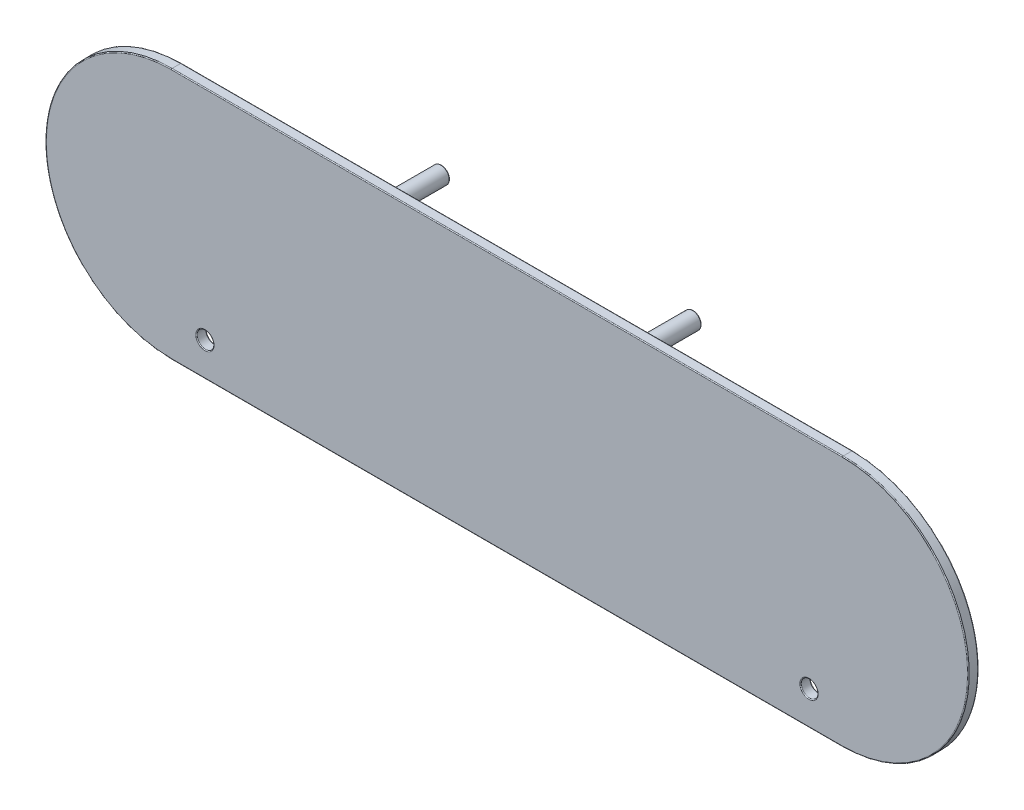
ISO-10303-21;
HEADER;
FILE_DESCRIPTION(('STEP AP214'),'2;1');
FILE_NAME('part.step','',(''),(''),'','','');
FILE_SCHEMA(('AUTOMOTIVE_DESIGN { 1 0 10303 214 1 1 1 1 }'));
ENDSEC;
DATA;
#1=APPLICATION_CONTEXT('core data for automotive mechanical design processes');
#2=APPLICATION_PROTOCOL_DEFINITION('international standard','automotive_design',2000,#1);
#3=PRODUCT_CONTEXT('',#1,'mechanical');
#4=PRODUCT('Part','Part','',(#3));
#5=PRODUCT_RELATED_PRODUCT_CATEGORY('part','',(#4));
#6=PRODUCT_DEFINITION_FORMATION('','',#4);
#7=PRODUCT_DEFINITION_CONTEXT('part definition',#1,'design');
#8=PRODUCT_DEFINITION('design','',#6,#7);
#9=PRODUCT_DEFINITION_SHAPE('','',#8);
#10=(LENGTH_UNIT() NAMED_UNIT(*) SI_UNIT(.MILLI.,.METRE.));
#11=(NAMED_UNIT(*) PLANE_ANGLE_UNIT() SI_UNIT($,.RADIAN.));
#12=(NAMED_UNIT(*) SI_UNIT($,.STERADIAN.) SOLID_ANGLE_UNIT());
#13=UNCERTAINTY_MEASURE_WITH_UNIT(LENGTH_MEASURE(1.E-05),#10,'distance_accuracy_value','');
#14=(GEOMETRIC_REPRESENTATION_CONTEXT(3) GLOBAL_UNCERTAINTY_ASSIGNED_CONTEXT((#13)) GLOBAL_UNIT_ASSIGNED_CONTEXT((#10,
#11,#12)) REPRESENTATION_CONTEXT('',''));
#15=CARTESIAN_POINT('',(0.,0.,0.));
#16=DIRECTION('',(0.,0.,1.));
#17=DIRECTION('',(1.,0.,0.));
#18=AXIS2_PLACEMENT_3D('',#15,#16,#17);
#19=CARTESIAN_POINT('',(0.,-37.5,3.));
#20=DIRECTION('',(0.,1.,0.));
#21=DIRECTION('',(0.,0.,1.));
#22=AXIS2_PLACEMENT_3D('',#19,#20,#21);
#23=PLANE('',#22);
#24=DIRECTION('',(0.,0.,-1.));
#25=VECTOR('',#24,1.);
#26=CARTESIAN_POINT('',(-100.,-37.5,3.));
#27=LINE('',#26,#25);
#28=CARTESIAN_POINT('',(-100.,-37.5,2.75));
#29=VERTEX_POINT('',#28);
#30=CARTESIAN_POINT('',(-100.,-37.5,0.25));
#31=VERTEX_POINT('',#30);
#32=EDGE_CURVE('E344',#29,#31,#27,.T.);
#33=ORIENTED_EDGE('',*,*,#32,.T.);
#34=DIRECTION('',(1.,0.,0.));
#35=VECTOR('',#34,1.);
#36=CARTESIAN_POINT('',(0.,-37.5,0.25));
#37=LINE('',#36,#35);
#38=CARTESIAN_POINT('',(100.,-37.5,0.25));
#39=VERTEX_POINT('',#38);
#40=EDGE_CURVE('E145',#31,#39,#37,.T.);
#41=ORIENTED_EDGE('',*,*,#40,.T.);
#42=DIRECTION('',(0.,0.,-1.));
#43=VECTOR('',#42,1.);
#44=CARTESIAN_POINT('',(100.,-37.5,3.));
#45=LINE('',#44,#43);
#46=CARTESIAN_POINT('',(100.,-37.5,2.75));
#47=VERTEX_POINT('',#46);
#48=EDGE_CURVE('E129',#47,#39,#45,.T.);
#49=ORIENTED_EDGE('',*,*,#48,.F.);
#50=DIRECTION('',(1.,0.,0.));
#51=VECTOR('',#50,1.);
#52=CARTESIAN_POINT('',(-100.,-37.5,2.75));
#53=LINE('',#52,#51);
#54=EDGE_CURVE('E142',#47,#29,#53,.F.);
#55=ORIENTED_EDGE('',*,*,#54,.T.);
#56=EDGE_LOOP('',(#33,#41,#49,#55));
#57=FACE_BOUND('',#56,.T.);
#58=ADVANCED_FACE('F60',(#57),#23,.F.);
#59=CARTESIAN_POINT('',(100.,0.,3.));
#60=DIRECTION('',(0.,0.,-1.));
#61=DIRECTION('',(-1.,0.,0.));
#62=AXIS2_PLACEMENT_3D('',#59,#60,#61);
#63=CYLINDRICAL_SURFACE('',#62,37.5);
#64=DIRECTION('',(0.,0.,-1.));
#65=VECTOR('',#64,1.);
#66=CARTESIAN_POINT('',(100.,37.5,3.));
#67=LINE('',#66,#65);
#68=CARTESIAN_POINT('',(100.,37.5,2.75));
#69=VERTEX_POINT('',#68);
#70=CARTESIAN_POINT('',(100.,37.5,0.25));
#71=VERTEX_POINT('',#70);
#72=EDGE_CURVE('E131',#69,#71,#67,.T.);
#73=ORIENTED_EDGE('',*,*,#72,.F.);
#74=CARTESIAN_POINT('',(100.,0.,2.75));
#75=DIRECTION('',(0.,0.,1.));
#76=DIRECTION('',(1.,0.,0.));
#77=AXIS2_PLACEMENT_3D('',#74,#75,#76);
#78=CIRCLE('',#77,37.5);
#79=EDGE_CURVE('E126',#69,#47,#78,.F.);
#80=ORIENTED_EDGE('',*,*,#79,.T.);
#81=ORIENTED_EDGE('',*,*,#48,.T.);
#82=CARTESIAN_POINT('',(100.,0.,0.25));
#83=DIRECTION('',(0.,0.,1.));
#84=DIRECTION('',(1.,0.,0.));
#85=AXIS2_PLACEMENT_3D('',#82,#83,#84);
#86=CIRCLE('',#85,37.5);
#87=EDGE_CURVE('E136',#39,#71,#86,.T.);
#88=ORIENTED_EDGE('',*,*,#87,.T.);
#89=EDGE_LOOP('',(#73,#80,#81,#88));
#90=FACE_BOUND('',#89,.T.);
#91=ADVANCED_FACE('F128',(#90),#63,.T.);
#92=CARTESIAN_POINT('',(0.,37.5,3.));
#93=DIRECTION('',(0.,1.,0.));
#94=DIRECTION('',(0.,0.,1.));
#95=AXIS2_PLACEMENT_3D('',#92,#93,#94);
#96=PLANE('',#95);
#97=ORIENTED_EDGE('',*,*,#72,.T.);
#98=DIRECTION('',(1.,0.,0.));
#99=VECTOR('',#98,1.);
#100=CARTESIAN_POINT('',(-100.,37.5,0.25));
#101=LINE('',#100,#99);
#102=CARTESIAN_POINT('',(-100.,37.5,0.25));
#103=VERTEX_POINT('',#102);
#104=EDGE_CURVE('E182',#71,#103,#101,.F.);
#105=ORIENTED_EDGE('',*,*,#104,.T.);
#106=DIRECTION('',(0.,0.,-1.));
#107=VECTOR('',#106,1.);
#108=CARTESIAN_POINT('',(-100.,37.5,3.));
#109=LINE('',#108,#107);
#110=CARTESIAN_POINT('',(-100.,37.5,2.75));
#111=VERTEX_POINT('',#110);
#112=EDGE_CURVE('E334',#111,#103,#109,.T.);
#113=ORIENTED_EDGE('',*,*,#112,.F.);
#114=DIRECTION('',(1.,0.,0.));
#115=VECTOR('',#114,1.);
#116=CARTESIAN_POINT('',(0.,37.5,2.75));
#117=LINE('',#116,#115);
#118=EDGE_CURVE('E180',#111,#69,#117,.T.);
#119=ORIENTED_EDGE('',*,*,#118,.T.);
#120=EDGE_LOOP('',(#97,#105,#113,#119));
#121=FACE_BOUND('',#120,.T.);
#122=ADVANCED_FACE('F330',(#121),#96,.T.);
#123=CARTESIAN_POINT('',(90.,-27.5,3.));
#124=DIRECTION('',(0.,0.,-1.));
#125=DIRECTION('',(-1.,0.,0.));
#126=AXIS2_PLACEMENT_3D('',#123,#124,#125);
#127=CYLINDRICAL_SURFACE('',#126,2.50000000000001);
#128=CARTESIAN_POINT('',(90.,-27.5,0.25));
#129=DIRECTION('',(0.,0.,1.));
#130=DIRECTION('',(1.,0.,0.));
#131=AXIS2_PLACEMENT_3D('',#128,#129,#130);
#132=CIRCLE('',#131,2.50000000000001);
#133=CARTESIAN_POINT('',(92.5,-27.5,0.25));
#134=VERTEX_POINT('',#133);
#135=EDGE_CURVE('E285',#134,#134,#132,.F.);
#136=ORIENTED_EDGE('',*,*,#135,.T.);
#137=EDGE_LOOP('',(#136));
#138=FACE_BOUND('',#137,.T.);
#139=CARTESIAN_POINT('',(90.,-27.5,2.75));
#140=DIRECTION('',(0.,0.,1.));
#141=DIRECTION('',(1.,0.,0.));
#142=AXIS2_PLACEMENT_3D('',#139,#140,#141);
#143=CIRCLE('',#142,2.50000000000001);
#144=CARTESIAN_POINT('',(92.5,-27.5,2.75));
#145=VERTEX_POINT('',#144);
#146=EDGE_CURVE('E199',#145,#145,#143,.T.);
#147=ORIENTED_EDGE('',*,*,#146,.T.);
#148=EDGE_LOOP('',(#147));
#149=FACE_BOUND('',#148,.T.);
#150=ADVANCED_FACE('F503',(#138,#149),#127,.F.);
#151=CARTESIAN_POINT('',(-100.,0.,3.));
#152=DIRECTION('',(0.,0.,-1.));
#153=DIRECTION('',(-1.,0.,0.));
#154=AXIS2_PLACEMENT_3D('',#151,#152,#153);
#155=CYLINDRICAL_SURFACE('',#154,37.5);
#156=ORIENTED_EDGE('',*,*,#112,.T.);
#157=CARTESIAN_POINT('',(-100.,0.,0.25));
#158=DIRECTION('',(0.,0.,1.));
#159=DIRECTION('',(1.,0.,0.));
#160=AXIS2_PLACEMENT_3D('',#157,#158,#159);
#161=CIRCLE('',#160,37.5);
#162=EDGE_CURVE('E178',#103,#31,#161,.T.);
#163=ORIENTED_EDGE('',*,*,#162,.T.);
#164=ORIENTED_EDGE('',*,*,#32,.F.);
#165=CARTESIAN_POINT('',(-100.,0.,2.75));
#166=DIRECTION('',(0.,0.,1.));
#167=DIRECTION('',(1.,0.,0.));
#168=AXIS2_PLACEMENT_3D('',#165,#166,#167);
#169=CIRCLE('',#168,37.5);
#170=EDGE_CURVE('E175',#29,#111,#169,.F.);
#171=ORIENTED_EDGE('',*,*,#170,.T.);
#172=EDGE_LOOP('',(#156,#163,#164,#171));
#173=FACE_BOUND('',#172,.T.);
#174=ADVANCED_FACE('F343',(#173),#155,.T.);
#175=CARTESIAN_POINT('',(-90.,-27.5,3.));
#176=DIRECTION('',(0.,0.,-1.));
#177=DIRECTION('',(-1.,0.,0.));
#178=AXIS2_PLACEMENT_3D('',#175,#176,#177);
#179=CYLINDRICAL_SURFACE('',#178,2.50000000000001);
#180=CARTESIAN_POINT('',(-90.,-27.5,0.25));
#181=DIRECTION('',(0.,0.,1.));
#182=DIRECTION('',(1.,0.,0.));
#183=AXIS2_PLACEMENT_3D('',#180,#181,#182);
#184=CIRCLE('',#183,2.50000000000001);
#185=CARTESIAN_POINT('',(-87.5,-27.5,0.25));
#186=VERTEX_POINT('',#185);
#187=EDGE_CURVE('E250',#186,#186,#184,.F.);
#188=ORIENTED_EDGE('',*,*,#187,.T.);
#189=EDGE_LOOP('',(#188));
#190=FACE_BOUND('',#189,.T.);
#191=CARTESIAN_POINT('',(-90.,-27.5,2.75));
#192=DIRECTION('',(0.,0.,1.));
#193=DIRECTION('',(1.,0.,0.));
#194=AXIS2_PLACEMENT_3D('',#191,#192,#193);
#195=CIRCLE('',#194,2.50000000000001);
#196=CARTESIAN_POINT('',(-87.5,-27.5,2.75));
#197=VERTEX_POINT('',#196);
#198=EDGE_CURVE('E196',#197,#197,#195,.T.);
#199=ORIENTED_EDGE('',*,*,#198,.T.);
#200=EDGE_LOOP('',(#199));
#201=FACE_BOUND('',#200,.T.);
#202=ADVANCED_FACE('F491',(#190,#201),#179,.F.);
#203=CARTESIAN_POINT('',(0.,0.,3.));
#204=DIRECTION('',(0.,0.,1.));
#205=DIRECTION('',(1.,0.,0.));
#206=AXIS2_PLACEMENT_3D('',#203,#204,#205);
#207=PLANE('',#206);
#208=CARTESIAN_POINT('',(-90.,-27.5,3.));
#209=DIRECTION('',(0.,0.,1.));
#210=DIRECTION('',(1.,0.,0.));
#211=AXIS2_PLACEMENT_3D('',#208,#209,#210);
#212=CIRCLE('',#211,2.75000000000001);
#213=CARTESIAN_POINT('',(-87.25,-27.5,3.));
#214=VERTEX_POINT('',#213);
#215=EDGE_CURVE('E193',#214,#214,#212,.F.);
#216=ORIENTED_EDGE('',*,*,#215,.T.);
#217=EDGE_LOOP('',(#216));
#218=FACE_BOUND('',#217,.T.);
#219=CARTESIAN_POINT('',(90.,-27.5,3.));
#220=DIRECTION('',(0.,0.,1.));
#221=DIRECTION('',(1.,0.,0.));
#222=AXIS2_PLACEMENT_3D('',#219,#220,#221);
#223=CIRCLE('',#222,2.75000000000001);
#224=CARTESIAN_POINT('',(92.75,-27.5,3.));
#225=VERTEX_POINT('',#224);
#226=EDGE_CURVE('E190',#225,#225,#223,.F.);
#227=ORIENTED_EDGE('',*,*,#226,.T.);
#228=EDGE_LOOP('',(#227));
#229=FACE_BOUND('',#228,.T.);
#230=DIRECTION('',(1.,0.,0.));
#231=VECTOR('',#230,1.);
#232=CARTESIAN_POINT('',(0.,37.25,3.));
#233=LINE('',#232,#231);
#234=CARTESIAN_POINT('',(100.,37.25,3.));
#235=VERTEX_POINT('',#234);
#236=CARTESIAN_POINT('',(-100.,37.25,3.));
#237=VERTEX_POINT('',#236);
#238=EDGE_CURVE('E75',#235,#237,#233,.F.);
#239=ORIENTED_EDGE('',*,*,#238,.T.);
#240=CARTESIAN_POINT('',(-100.,0.,3.));
#241=DIRECTION('',(0.,0.,1.));
#242=DIRECTION('',(1.,0.,0.));
#243=AXIS2_PLACEMENT_3D('',#240,#241,#242);
#244=CIRCLE('',#243,37.25);
#245=CARTESIAN_POINT('',(-100.,-37.25,3.));
#246=VERTEX_POINT('',#245);
#247=EDGE_CURVE('E188',#237,#246,#244,.T.);
#248=ORIENTED_EDGE('',*,*,#247,.T.);
#249=DIRECTION('',(1.,0.,0.));
#250=VECTOR('',#249,1.);
#251=CARTESIAN_POINT('',(100.,-37.25,3.));
#252=LINE('',#251,#250);
#253=CARTESIAN_POINT('',(100.,-37.25,3.));
#254=VERTEX_POINT('',#253);
#255=EDGE_CURVE('E184',#246,#254,#252,.T.);
#256=ORIENTED_EDGE('',*,*,#255,.T.);
#257=CARTESIAN_POINT('',(100.,0.,3.));
#258=DIRECTION('',(0.,0.,1.));
#259=DIRECTION('',(1.,0.,0.));
#260=AXIS2_PLACEMENT_3D('',#257,#258,#259);
#261=CIRCLE('',#260,37.25);
#262=EDGE_CURVE('E80',#254,#235,#261,.T.);
#263=ORIENTED_EDGE('',*,*,#262,.T.);
#264=EDGE_LOOP('',(#239,#248,#256,#263));
#265=FACE_BOUND('',#264,.T.);
#266=ADVANCED_FACE('F309',(#218,#229,#265),#207,.T.);
#267=CARTESIAN_POINT('',(0.,0.,0.));
#268=DIRECTION('',(0.,0.,1.));
#269=DIRECTION('',(1.,0.,0.));
#270=AXIS2_PLACEMENT_3D('',#267,#268,#269);
#271=PLANE('',#270);
#272=CARTESIAN_POINT('',(-90.,-27.5,0.));
#273=DIRECTION('',(0.,0.,1.));
#274=DIRECTION('',(1.,0.,0.));
#275=AXIS2_PLACEMENT_3D('',#272,#273,#274);
#276=CIRCLE('',#275,2.75000000000001);
#277=CARTESIAN_POINT('',(-87.25,-27.5,0.));
#278=VERTEX_POINT('',#277);
#279=EDGE_CURVE('E282',#278,#278,#276,.T.);
#280=ORIENTED_EDGE('',*,*,#279,.T.);
#281=EDGE_LOOP('',(#280));
#282=FACE_BOUND('',#281,.T.);
#283=CARTESIAN_POINT('',(90.,-27.5,0.));
#284=DIRECTION('',(0.,0.,1.));
#285=DIRECTION('',(1.,0.,0.));
#286=AXIS2_PLACEMENT_3D('',#283,#284,#285);
#287=CIRCLE('',#286,2.75000000000001);
#288=CARTESIAN_POINT('',(92.75,-27.5,0.));
#289=VERTEX_POINT('',#288);
#290=EDGE_CURVE('E279',#289,#289,#287,.T.);
#291=ORIENTED_EDGE('',*,*,#290,.T.);
#292=EDGE_LOOP('',(#291));
#293=FACE_BOUND('',#292,.T.);
#294=CARTESIAN_POINT('',(-75.,-32.5,0.));
#295=DIRECTION('',(0.,0.,1.));
#296=DIRECTION('',(1.,0.,0.));
#297=AXIS2_PLACEMENT_3D('',#294,#295,#296);
#298=CIRCLE('',#297,2.75000000000001);
#299=CARTESIAN_POINT('',(-72.25,-32.5,0.));
#300=VERTEX_POINT('',#299);
#301=EDGE_CURVE('E276',#300,#300,#298,.T.);
#302=ORIENTED_EDGE('',*,*,#301,.T.);
#303=EDGE_LOOP('',(#302));
#304=FACE_BOUND('',#303,.T.);
#305=CARTESIAN_POINT('',(75.,-32.5,0.));
#306=DIRECTION('',(0.,0.,1.));
#307=DIRECTION('',(1.,0.,0.));
#308=AXIS2_PLACEMENT_3D('',#305,#306,#307);
#309=CIRCLE('',#308,2.75000000000001);
#310=CARTESIAN_POINT('',(77.75,-32.5,0.));
#311=VERTEX_POINT('',#310);
#312=EDGE_CURVE('E273',#311,#311,#309,.T.);
#313=ORIENTED_EDGE('',*,*,#312,.T.);
#314=EDGE_LOOP('',(#313));
#315=FACE_BOUND('',#314,.T.);
#316=CARTESIAN_POINT('',(37.5,32.5,0.));
#317=DIRECTION('',(0.,0.,1.));
#318=DIRECTION('',(1.,0.,0.));
#319=AXIS2_PLACEMENT_3D('',#316,#317,#318);
#320=CIRCLE('',#319,2.75);
#321=CARTESIAN_POINT('',(40.25,32.5,0.));
#322=VERTEX_POINT('',#321);
#323=EDGE_CURVE('E270',#322,#322,#320,.T.);
#324=ORIENTED_EDGE('',*,*,#323,.T.);
#325=EDGE_LOOP('',(#324));
#326=FACE_BOUND('',#325,.T.);
#327=CARTESIAN_POINT('',(-37.5,32.5,0.));
#328=DIRECTION('',(0.,0.,1.));
#329=DIRECTION('',(1.,0.,0.));
#330=AXIS2_PLACEMENT_3D('',#327,#328,#329);
#331=CIRCLE('',#330,2.75);
#332=CARTESIAN_POINT('',(-34.75,32.5,0.));
#333=VERTEX_POINT('',#332);
#334=EDGE_CURVE('E267',#333,#333,#331,.T.);
#335=ORIENTED_EDGE('',*,*,#334,.T.);
#336=EDGE_LOOP('',(#335));
#337=FACE_BOUND('',#336,.T.);
#338=CARTESIAN_POINT('',(100.,0.,0.));
#339=DIRECTION('',(0.,0.,1.));
#340=DIRECTION('',(1.,0.,0.));
#341=AXIS2_PLACEMENT_3D('',#338,#339,#340);
#342=CIRCLE('',#341,37.25);
#343=CARTESIAN_POINT('',(100.,37.25,0.));
#344=VERTEX_POINT('',#343);
#345=CARTESIAN_POINT('',(100.,-37.25,0.));
#346=VERTEX_POINT('',#345);
#347=EDGE_CURVE('E161',#344,#346,#342,.F.);
#348=ORIENTED_EDGE('',*,*,#347,.T.);
#349=DIRECTION('',(1.,0.,0.));
#350=VECTOR('',#349,1.);
#351=CARTESIAN_POINT('',(0.,-37.25,0.));
#352=LINE('',#351,#350);
#353=CARTESIAN_POINT('',(-100.,-37.25,0.));
#354=VERTEX_POINT('',#353);
#355=EDGE_CURVE('E172',#346,#354,#352,.F.);
#356=ORIENTED_EDGE('',*,*,#355,.T.);
#357=CARTESIAN_POINT('',(-100.,0.,0.));
#358=DIRECTION('',(0.,0.,1.));
#359=DIRECTION('',(1.,0.,0.));
#360=AXIS2_PLACEMENT_3D('',#357,#358,#359);
#361=CIRCLE('',#360,37.25);
#362=CARTESIAN_POINT('',(-100.,37.25,0.));
#363=VERTEX_POINT('',#362);
#364=EDGE_CURVE('E170',#354,#363,#361,.F.);
#365=ORIENTED_EDGE('',*,*,#364,.T.);
#366=DIRECTION('',(1.,0.,0.));
#367=VECTOR('',#366,1.);
#368=CARTESIAN_POINT('',(100.,37.25,0.));
#369=LINE('',#368,#367);
#370=EDGE_CURVE('E168',#363,#344,#369,.T.);
#371=ORIENTED_EDGE('',*,*,#370,.T.);
#372=EDGE_LOOP('',(#348,#356,#365,#371));
#373=FACE_BOUND('',#372,.T.);
#374=ADVANCED_FACE('F305',(#282,#293,#304,#315,#326,#337,#373),#271,.F.);
#375=CARTESIAN_POINT('',(-75.,-32.5,-15.));
#376=DIRECTION('',(0.,0.,-1.));
#377=DIRECTION('',(-1.,0.,0.));
#378=AXIS2_PLACEMENT_3D('',#375,#376,#377);
#379=PLANE('',#378);
#380=CARTESIAN_POINT('',(-75.,-32.5,-15.));
#381=DIRECTION('',(0.,0.,-1.));
#382=DIRECTION('',(-1.,0.,0.));
#383=AXIS2_PLACEMENT_3D('',#380,#381,#382);
#384=CIRCLE('',#383,0.500000000000009);
#385=CARTESIAN_POINT('',(-75.5,-32.5,-15.));
#386=VERTEX_POINT('',#385);
#387=EDGE_CURVE('E220',#386,#386,#384,.F.);
#388=ORIENTED_EDGE('',*,*,#387,.T.);
#389=EDGE_LOOP('',(#388));
#390=FACE_BOUND('',#389,.T.);
#391=CARTESIAN_POINT('',(-75.,-32.5,-15.));
#392=DIRECTION('',(0.,0.,-1.));
#393=DIRECTION('',(-1.,0.,0.));
#394=AXIS2_PLACEMENT_3D('',#391,#392,#393);
#395=CIRCLE('',#394,2.25000000000001);
#396=CARTESIAN_POINT('',(-77.25,-32.5,-15.));
#397=VERTEX_POINT('',#396);
#398=EDGE_CURVE('E217',#397,#397,#395,.T.);
#399=ORIENTED_EDGE('',*,*,#398,.T.);
#400=EDGE_LOOP('',(#399));
#401=FACE_BOUND('',#400,.T.);
#402=ADVANCED_FACE('F308',(#390,#401),#379,.T.);
#403=CARTESIAN_POINT('',(-75.,-32.5,-15.));
#404=DIRECTION('',(0.,0.,1.));
#405=DIRECTION('',(1.,0.,0.));
#406=AXIS2_PLACEMENT_3D('',#403,#404,#405);
#407=CYLINDRICAL_SURFACE('',#406,2.50000000000001);
#408=CARTESIAN_POINT('',(-75.,-32.5,-0.25));
#409=DIRECTION('',(0.,0.,1.));
#410=DIRECTION('',(1.,0.,0.));
#411=AXIS2_PLACEMENT_3D('',#408,#409,#410);
#412=CIRCLE('',#411,2.50000000000001);
#413=CARTESIAN_POINT('',(-72.5,-32.5,-0.25));
#414=VERTEX_POINT('',#413);
#415=EDGE_CURVE('E288',#414,#414,#412,.F.);
#416=ORIENTED_EDGE('',*,*,#415,.T.);
#417=EDGE_LOOP('',(#416));
#418=FACE_BOUND('',#417,.T.);
#419=CARTESIAN_POINT('',(-75.,-32.5,-14.75));
#420=DIRECTION('',(0.,0.,-1.));
#421=DIRECTION('',(-1.,0.,0.));
#422=AXIS2_PLACEMENT_3D('',#419,#420,#421);
#423=CIRCLE('',#422,2.50000000000001);
#424=CARTESIAN_POINT('',(-77.5,-32.5,-14.75));
#425=VERTEX_POINT('',#424);
#426=EDGE_CURVE('E223',#425,#425,#423,.F.);
#427=ORIENTED_EDGE('',*,*,#426,.T.);
#428=EDGE_LOOP('',(#427));
#429=FACE_BOUND('',#428,.T.);
#430=ADVANCED_FACE('F483',(#418,#429),#407,.T.);
#431=CARTESIAN_POINT('',(-75.,-32.5,-15.));
#432=DIRECTION('',(0.,0.,1.));
#433=DIRECTION('',(1.,0.,0.));
#434=AXIS2_PLACEMENT_3D('',#431,#432,#433);
#435=CYLINDRICAL_SURFACE('',#434,0.250000000000009);
#436=CARTESIAN_POINT('',(-75.,-32.5,-14.75));
#437=DIRECTION('',(0.,0.,-1.));
#438=DIRECTION('',(-1.,0.,0.));
#439=AXIS2_PLACEMENT_3D('',#436,#437,#438);
#440=CIRCLE('',#439,0.250000000000009);
#441=CARTESIAN_POINT('',(-75.25,-32.5,-14.75));
#442=VERTEX_POINT('',#441);
#443=EDGE_CURVE('E214',#442,#442,#440,.T.);
#444=ORIENTED_EDGE('',*,*,#443,.T.);
#445=EDGE_LOOP('',(#444));
#446=FACE_BOUND('',#445,.T.);
#447=CARTESIAN_POINT('',(-75.,-32.5,0.));
#448=DIRECTION('',(0.,0.,-1.));
#449=DIRECTION('',(-1.,0.,0.));
#450=AXIS2_PLACEMENT_3D('',#447,#448,#449);
#451=CIRCLE('',#450,0.250000000000009);
#452=CARTESIAN_POINT('',(-75.25,-32.5,0.));
#453=VERTEX_POINT('',#452);
#454=EDGE_CURVE('E346',#453,#453,#451,.T.);
#455=ORIENTED_EDGE('',*,*,#454,.F.);
#456=EDGE_LOOP('',(#455));
#457=FACE_BOUND('',#456,.T.);
#458=ADVANCED_FACE('F373',(#446,#457),#435,.F.);
#459=ORIENTED_EDGE('',*,*,#454,.T.);
#460=EDGE_LOOP('',(#459));
#461=FACE_BOUND('',#460,.T.);
#462=ADVANCED_FACE('F313',(#461),#271,.F.);
#463=CARTESIAN_POINT('',(75.,-32.5,-15.));
#464=DIRECTION('',(0.,0.,1.));
#465=DIRECTION('',(1.,0.,0.));
#466=AXIS2_PLACEMENT_3D('',#463,#464,#465);
#467=CYLINDRICAL_SURFACE('',#466,2.50000000000001);
#468=CARTESIAN_POINT('',(75.,-32.5,-0.25));
#469=DIRECTION('',(0.,0.,1.));
#470=DIRECTION('',(1.,0.,0.));
#471=AXIS2_PLACEMENT_3D('',#468,#469,#470);
#472=CIRCLE('',#471,2.50000000000001);
#473=CARTESIAN_POINT('',(77.5,-32.5,-0.25));
#474=VERTEX_POINT('',#473);
#475=EDGE_CURVE('E291',#474,#474,#472,.F.);
#476=ORIENTED_EDGE('',*,*,#475,.T.);
#477=EDGE_LOOP('',(#476));
#478=FACE_BOUND('',#477,.T.);
#479=CARTESIAN_POINT('',(75.,-32.5,-14.75));
#480=DIRECTION('',(0.,0.,1.));
#481=DIRECTION('',(1.,0.,0.));
#482=AXIS2_PLACEMENT_3D('',#479,#480,#481);
#483=CIRCLE('',#482,2.50000000000001);
#484=CARTESIAN_POINT('',(77.5,-32.5,-14.75));
#485=VERTEX_POINT('',#484);
#486=EDGE_CURVE('E135',#485,#485,#483,.T.);
#487=ORIENTED_EDGE('',*,*,#486,.T.);
#488=EDGE_LOOP('',(#487));
#489=FACE_BOUND('',#488,.T.);
#490=ADVANCED_FACE('F372',(#478,#489),#467,.T.);
#491=CARTESIAN_POINT('',(75.,-32.5,-15.));
#492=DIRECTION('',(0.,0.,1.));
#493=DIRECTION('',(1.,0.,0.));
#494=AXIS2_PLACEMENT_3D('',#491,#492,#493);
#495=PLANE('',#494);
#496=CARTESIAN_POINT('',(75.,-32.5,-15.));
#497=DIRECTION('',(0.,0.,1.));
#498=DIRECTION('',(1.,0.,0.));
#499=AXIS2_PLACEMENT_3D('',#496,#497,#498);
#500=CIRCLE('',#499,2.25000000000001);
#501=CARTESIAN_POINT('',(77.25,-32.5,-15.));
#502=VERTEX_POINT('',#501);
#503=EDGE_CURVE('E208',#502,#502,#500,.F.);
#504=ORIENTED_EDGE('',*,*,#503,.T.);
#505=EDGE_LOOP('',(#504));
#506=FACE_BOUND('',#505,.T.);
#507=CARTESIAN_POINT('',(75.,-32.5,-15.));
#508=DIRECTION('',(0.,0.,1.));
#509=DIRECTION('',(1.,0.,0.));
#510=AXIS2_PLACEMENT_3D('',#507,#508,#509);
#511=CIRCLE('',#510,0.500000000000009);
#512=CARTESIAN_POINT('',(75.5,-32.5,-15.));
#513=VERTEX_POINT('',#512);
#514=EDGE_CURVE('E205',#513,#513,#511,.T.);
#515=ORIENTED_EDGE('',*,*,#514,.T.);
#516=EDGE_LOOP('',(#515));
#517=FACE_BOUND('',#516,.T.);
#518=ADVANCED_FACE('F366',(#506,#517),#495,.F.);
#519=CARTESIAN_POINT('',(75.,-32.5,-15.));
#520=DIRECTION('',(0.,0.,1.));
#521=DIRECTION('',(1.,0.,0.));
#522=AXIS2_PLACEMENT_3D('',#519,#520,#521);
#523=CYLINDRICAL_SURFACE('',#522,0.250000000000009);
#524=CARTESIAN_POINT('',(75.,-32.5,-14.75));
#525=DIRECTION('',(0.,0.,1.));
#526=DIRECTION('',(1.,0.,0.));
#527=AXIS2_PLACEMENT_3D('',#524,#525,#526);
#528=CIRCLE('',#527,0.250000000000009);
#529=CARTESIAN_POINT('',(75.25,-32.5,-14.75));
#530=VERTEX_POINT('',#529);
#531=EDGE_CURVE('E211',#530,#530,#528,.F.);
#532=ORIENTED_EDGE('',*,*,#531,.T.);
#533=EDGE_LOOP('',(#532));
#534=FACE_BOUND('',#533,.T.);
#535=CARTESIAN_POINT('',(75.,-32.5,0.));
#536=DIRECTION('',(0.,0.,1.));
#537=DIRECTION('',(1.,0.,0.));
#538=AXIS2_PLACEMENT_3D('',#535,#536,#537);
#539=CIRCLE('',#538,0.250000000000009);
#540=CARTESIAN_POINT('',(75.25,-32.5,0.));
#541=VERTEX_POINT('',#540);
#542=EDGE_CURVE('E146',#541,#541,#539,.T.);
#543=ORIENTED_EDGE('',*,*,#542,.T.);
#544=EDGE_LOOP('',(#543));
#545=FACE_BOUND('',#544,.T.);
#546=ADVANCED_FACE('F355',(#534,#545),#523,.F.);
#547=ORIENTED_EDGE('',*,*,#542,.F.);
#548=EDGE_LOOP('',(#547));
#549=FACE_BOUND('',#548,.T.);
#550=ADVANCED_FACE('F357',(#549),#271,.F.);
#551=CARTESIAN_POINT('',(37.5,32.5,-15.));
#552=DIRECTION('',(0.,0.,1.));
#553=DIRECTION('',(1.,0.,0.));
#554=AXIS2_PLACEMENT_3D('',#551,#552,#553);
#555=CYLINDRICAL_SURFACE('',#554,2.5);
#556=CARTESIAN_POINT('',(37.5,32.5,-0.25));
#557=DIRECTION('',(0.,0.,1.));
#558=DIRECTION('',(1.,0.,0.));
#559=AXIS2_PLACEMENT_3D('',#556,#557,#558);
#560=CIRCLE('',#559,2.5);
#561=CARTESIAN_POINT('',(40.,32.5,-0.25));
#562=VERTEX_POINT('',#561);
#563=EDGE_CURVE('E68',#562,#562,#560,.F.);
#564=ORIENTED_EDGE('',*,*,#563,.T.);
#565=EDGE_LOOP('',(#564));
#566=FACE_BOUND('',#565,.T.);
#567=CARTESIAN_POINT('',(37.5,32.5,-14.75));
#568=DIRECTION('',(0.,0.,1.));
#569=DIRECTION('',(1.,0.,0.));
#570=AXIS2_PLACEMENT_3D('',#567,#568,#569);
#571=CIRCLE('',#570,2.5);
#572=CARTESIAN_POINT('',(40.,32.5,-14.75));
#573=VERTEX_POINT('',#572);
#574=EDGE_CURVE('E238',#573,#573,#571,.T.);
#575=ORIENTED_EDGE('',*,*,#574,.T.);
#576=EDGE_LOOP('',(#575));
#577=FACE_BOUND('',#576,.T.);
#578=ADVANCED_FACE('F296',(#566,#577),#555,.T.);
#579=CARTESIAN_POINT('',(37.5,32.5,-15.));
#580=DIRECTION('',(0.,0.,1.));
#581=DIRECTION('',(1.,0.,0.));
#582=AXIS2_PLACEMENT_3D('',#579,#580,#581);
#583=PLANE('',#582);
#584=CARTESIAN_POINT('',(37.5,32.5,-15.));
#585=DIRECTION('',(0.,0.,1.));
#586=DIRECTION('',(1.,0.,0.));
#587=AXIS2_PLACEMENT_3D('',#584,#585,#586);
#588=CIRCLE('',#587,2.25);
#589=CARTESIAN_POINT('',(39.75,32.5,-15.));
#590=VERTEX_POINT('',#589);
#591=EDGE_CURVE('E244',#590,#590,#588,.F.);
#592=ORIENTED_EDGE('',*,*,#591,.T.);
#593=EDGE_LOOP('',(#592));
#594=FACE_BOUND('',#593,.T.);
#595=CARTESIAN_POINT('',(37.5,32.5,-15.));
#596=DIRECTION('',(0.,0.,1.));
#597=DIRECTION('',(1.,0.,0.));
#598=AXIS2_PLACEMENT_3D('',#595,#596,#597);
#599=CIRCLE('',#598,0.500000000000003);
#600=CARTESIAN_POINT('',(38.,32.5,-15.));
#601=VERTEX_POINT('',#600);
#602=EDGE_CURVE('E241',#601,#601,#599,.T.);
#603=ORIENTED_EDGE('',*,*,#602,.T.);
#604=EDGE_LOOP('',(#603));
#605=FACE_BOUND('',#604,.T.);
#606=ADVANCED_FACE('F364',(#594,#605),#583,.F.);
#607=CARTESIAN_POINT('',(37.5,32.5,-15.));
#608=DIRECTION('',(0.,0.,1.));
#609=DIRECTION('',(1.,0.,0.));
#610=AXIS2_PLACEMENT_3D('',#607,#608,#609);
#611=CYLINDRICAL_SURFACE('',#610,0.250000000000003);
#612=CARTESIAN_POINT('',(37.5,32.5,-14.75));
#613=DIRECTION('',(0.,0.,1.));
#614=DIRECTION('',(1.,0.,0.));
#615=AXIS2_PLACEMENT_3D('',#612,#613,#614);
#616=CIRCLE('',#615,0.250000000000003);
#617=CARTESIAN_POINT('',(37.75,32.5,-14.75));
#618=VERTEX_POINT('',#617);
#619=EDGE_CURVE('E247',#618,#618,#616,.F.);
#620=ORIENTED_EDGE('',*,*,#619,.T.);
#621=EDGE_LOOP('',(#620));
#622=FACE_BOUND('',#621,.T.);
#623=CARTESIAN_POINT('',(37.5,32.5,0.));
#624=DIRECTION('',(0.,0.,1.));
#625=DIRECTION('',(1.,0.,0.));
#626=AXIS2_PLACEMENT_3D('',#623,#624,#625);
#627=CIRCLE('',#626,0.250000000000003);
#628=CARTESIAN_POINT('',(37.75,32.5,0.));
#629=VERTEX_POINT('',#628);
#630=EDGE_CURVE('E159',#629,#629,#627,.T.);
#631=ORIENTED_EDGE('',*,*,#630,.T.);
#632=EDGE_LOOP('',(#631));
#633=FACE_BOUND('',#632,.T.);
#634=ADVANCED_FACE('F377',(#622,#633),#611,.F.);
#635=ORIENTED_EDGE('',*,*,#630,.F.);
#636=EDGE_LOOP('',(#635));
#637=FACE_BOUND('',#636,.T.);
#638=ADVANCED_FACE('F359',(#637),#271,.F.);
#639=CARTESIAN_POINT('',(-37.5,32.5,-15.));
#640=DIRECTION('',(0.,0.,-1.));
#641=DIRECTION('',(-1.,0.,0.));
#642=AXIS2_PLACEMENT_3D('',#639,#640,#641);
#643=PLANE('',#642);
#644=CARTESIAN_POINT('',(-37.5,32.5,-15.));
#645=DIRECTION('',(0.,0.,-1.));
#646=DIRECTION('',(-1.,0.,0.));
#647=AXIS2_PLACEMENT_3D('',#644,#645,#646);
#648=CIRCLE('',#647,0.500000000000003);
#649=CARTESIAN_POINT('',(-38.,32.5,-15.));
#650=VERTEX_POINT('',#649);
#651=EDGE_CURVE('E232',#650,#650,#648,.F.);
#652=ORIENTED_EDGE('',*,*,#651,.T.);
#653=EDGE_LOOP('',(#652));
#654=FACE_BOUND('',#653,.T.);
#655=CARTESIAN_POINT('',(-37.5,32.5,-15.));
#656=DIRECTION('',(0.,0.,-1.));
#657=DIRECTION('',(-1.,0.,0.));
#658=AXIS2_PLACEMENT_3D('',#655,#656,#657);
#659=CIRCLE('',#658,2.25);
#660=CARTESIAN_POINT('',(-39.75,32.5,-15.));
#661=VERTEX_POINT('',#660);
#662=EDGE_CURVE('E229',#661,#661,#659,.T.);
#663=ORIENTED_EDGE('',*,*,#662,.T.);
#664=EDGE_LOOP('',(#663));
#665=FACE_BOUND('',#664,.T.);
#666=ADVANCED_FACE('F376',(#654,#665),#643,.T.);
#667=CARTESIAN_POINT('',(-37.5,32.5,-15.));
#668=DIRECTION('',(0.,0.,1.));
#669=DIRECTION('',(1.,0.,0.));
#670=AXIS2_PLACEMENT_3D('',#667,#668,#669);
#671=CYLINDRICAL_SURFACE('',#670,2.5);
#672=CARTESIAN_POINT('',(-37.5,32.5,-0.25));
#673=DIRECTION('',(0.,0.,1.));
#674=DIRECTION('',(1.,0.,0.));
#675=AXIS2_PLACEMENT_3D('',#672,#673,#674);
#676=CIRCLE('',#675,2.5);
#677=CARTESIAN_POINT('',(-35.,32.5,-0.25));
#678=VERTEX_POINT('',#677);
#679=EDGE_CURVE('E12',#678,#678,#676,.F.);
#680=ORIENTED_EDGE('',*,*,#679,.T.);
#681=EDGE_LOOP('',(#680));
#682=FACE_BOUND('',#681,.T.);
#683=CARTESIAN_POINT('',(-37.5,32.5,-14.75));
#684=DIRECTION('',(0.,0.,-1.));
#685=DIRECTION('',(-1.,0.,0.));
#686=AXIS2_PLACEMENT_3D('',#683,#684,#685);
#687=CIRCLE('',#686,2.5);
#688=CARTESIAN_POINT('',(-40.,32.5,-14.75));
#689=VERTEX_POINT('',#688);
#690=EDGE_CURVE('E235',#689,#689,#687,.F.);
#691=ORIENTED_EDGE('',*,*,#690,.T.);
#692=EDGE_LOOP('',(#691));
#693=FACE_BOUND('',#692,.T.);
#694=ADVANCED_FACE('F712',(#682,#693),#671,.T.);
#695=CARTESIAN_POINT('',(-37.5,32.5,-15.));
#696=DIRECTION('',(0.,0.,1.));
#697=DIRECTION('',(1.,0.,0.));
#698=AXIS2_PLACEMENT_3D('',#695,#696,#697);
#699=CYLINDRICAL_SURFACE('',#698,0.250000000000003);
#700=CARTESIAN_POINT('',(-37.5,32.5,-14.75));
#701=DIRECTION('',(0.,0.,-1.));
#702=DIRECTION('',(-1.,0.,0.));
#703=AXIS2_PLACEMENT_3D('',#700,#701,#702);
#704=CIRCLE('',#703,0.250000000000003);
#705=CARTESIAN_POINT('',(-37.75,32.5,-14.75));
#706=VERTEX_POINT('',#705);
#707=EDGE_CURVE('E226',#706,#706,#704,.T.);
#708=ORIENTED_EDGE('',*,*,#707,.T.);
#709=EDGE_LOOP('',(#708));
#710=FACE_BOUND('',#709,.T.);
#711=CARTESIAN_POINT('',(-37.5,32.5,0.));
#712=DIRECTION('',(0.,0.,-1.));
#713=DIRECTION('',(-1.,0.,0.));
#714=AXIS2_PLACEMENT_3D('',#711,#712,#713);
#715=CIRCLE('',#714,0.250000000000003);
#716=CARTESIAN_POINT('',(-37.75,32.5,0.));
#717=VERTEX_POINT('',#716);
#718=EDGE_CURVE('E261',#717,#717,#715,.T.);
#719=ORIENTED_EDGE('',*,*,#718,.F.);
#720=EDGE_LOOP('',(#719));
#721=FACE_BOUND('',#720,.T.);
#722=ADVANCED_FACE('F545',(#710,#721),#699,.F.);
#723=ORIENTED_EDGE('',*,*,#718,.T.);
#724=EDGE_LOOP('',(#723));
#725=FACE_BOUND('',#724,.T.);
#726=ADVANCED_FACE('F312',(#725),#271,.F.);
#727=CARTESIAN_POINT('',(0.,37.25,0.25));
#728=DIRECTION('',(-1.,0.,0.));
#729=DIRECTION('',(0.,0.,1.));
#730=AXIS2_PLACEMENT_3D('',#727,#728,#729);
#731=CYLINDRICAL_SURFACE('',#730,0.25);
#732=CARTESIAN_POINT('',(100.,37.25,0.25));
#733=DIRECTION('',(1.,0.,0.));
#734=DIRECTION('',(0.,0.,-1.));
#735=AXIS2_PLACEMENT_3D('',#732,#733,#734);
#736=CIRCLE('',#735,0.25);
#737=EDGE_CURVE('E255',#344,#71,#736,.T.);
#738=ORIENTED_EDGE('',*,*,#737,.F.);
#739=ORIENTED_EDGE('',*,*,#370,.F.);
#740=CARTESIAN_POINT('',(-100.,37.25,0.25));
#741=DIRECTION('',(-1.,0.,0.));
#742=DIRECTION('',(0.,0.,1.));
#743=AXIS2_PLACEMENT_3D('',#740,#741,#742);
#744=CIRCLE('',#743,0.25);
#745=EDGE_CURVE('E258',#103,#363,#744,.T.);
#746=ORIENTED_EDGE('',*,*,#745,.F.);
#747=ORIENTED_EDGE('',*,*,#104,.F.);
#748=EDGE_LOOP('',(#738,#739,#746,#747));
#749=FACE_BOUND('',#748,.T.);
#750=ADVANCED_FACE('F338',(#749),#731,.T.);
#751=CARTESIAN_POINT('',(-100.,0.,0.25));
#752=DIRECTION('',(0.,0.,1.));
#753=DIRECTION('',(1.,0.,0.));
#754=AXIS2_PLACEMENT_3D('',#751,#752,#753);
#755=TOROIDAL_SURFACE('',#754,37.25,0.25);
#756=ORIENTED_EDGE('',*,*,#745,.T.);
#757=ORIENTED_EDGE('',*,*,#364,.F.);
#758=CARTESIAN_POINT('',(-100.,-37.25,0.25));
#759=DIRECTION('',(1.,0.,0.));
#760=DIRECTION('',(0.,0.,-1.));
#761=AXIS2_PLACEMENT_3D('',#758,#759,#760);
#762=CIRCLE('',#761,0.25);
#763=EDGE_CURVE('E253',#31,#354,#762,.T.);
#764=ORIENTED_EDGE('',*,*,#763,.F.);
#765=ORIENTED_EDGE('',*,*,#162,.F.);
#766=EDGE_LOOP('',(#756,#757,#764,#765));
#767=FACE_BOUND('',#766,.T.);
#768=ADVANCED_FACE('F341',(#767),#755,.T.);
#769=CARTESIAN_POINT('',(100.,0.,0.25));
#770=DIRECTION('',(0.,0.,1.));
#771=DIRECTION('',(1.,0.,0.));
#772=AXIS2_PLACEMENT_3D('',#769,#770,#771);
#773=TOROIDAL_SURFACE('',#772,37.25,0.25);
#774=ORIENTED_EDGE('',*,*,#737,.T.);
#775=ORIENTED_EDGE('',*,*,#87,.F.);
#776=CARTESIAN_POINT('',(100.,-37.25,0.25));
#777=DIRECTION('',(-1.,0.,0.));
#778=DIRECTION('',(0.,0.,1.));
#779=AXIS2_PLACEMENT_3D('',#776,#777,#778);
#780=CIRCLE('',#779,0.25);
#781=EDGE_CURVE('E251',#346,#39,#780,.T.);
#782=ORIENTED_EDGE('',*,*,#781,.F.);
#783=ORIENTED_EDGE('',*,*,#347,.F.);
#784=EDGE_LOOP('',(#774,#775,#782,#783));
#785=FACE_BOUND('',#784,.T.);
#786=ADVANCED_FACE('F327',(#785),#773,.T.);
#787=CARTESIAN_POINT('',(0.,-37.25,0.25));
#788=DIRECTION('',(1.,0.,0.));
#789=DIRECTION('',(0.,0.,-1.));
#790=AXIS2_PLACEMENT_3D('',#787,#788,#789);
#791=CYLINDRICAL_SURFACE('',#790,0.25);
#792=ORIENTED_EDGE('',*,*,#763,.T.);
#793=ORIENTED_EDGE('',*,*,#355,.F.);
#794=ORIENTED_EDGE('',*,*,#781,.T.);
#795=ORIENTED_EDGE('',*,*,#40,.F.);
#796=EDGE_LOOP('',(#792,#793,#794,#795));
#797=FACE_BOUND('',#796,.T.);
#798=ADVANCED_FACE('F323',(#797),#791,.T.);
#799=CARTESIAN_POINT('',(-90.,-27.5,2.75));
#800=DIRECTION('',(0.,0.,1.));
#801=DIRECTION('',(1.,0.,0.));
#802=AXIS2_PLACEMENT_3D('',#799,#800,#801);
#803=TOROIDAL_SURFACE('',#802,2.75000000000001,0.25);
#804=ORIENTED_EDGE('',*,*,#198,.F.);
#805=EDGE_LOOP('',(#804));
#806=FACE_BOUND('',#805,.T.);
#807=ORIENTED_EDGE('',*,*,#215,.F.);
#808=EDGE_LOOP('',(#807));
#809=FACE_BOUND('',#808,.T.);
#810=ADVANCED_FACE('F389',(#806,#809),#803,.T.);
#811=CARTESIAN_POINT('',(90.,-27.5,2.75));
#812=DIRECTION('',(0.,0.,1.));
#813=DIRECTION('',(1.,0.,0.));
#814=AXIS2_PLACEMENT_3D('',#811,#812,#813);
#815=TOROIDAL_SURFACE('',#814,2.75000000000001,0.25);
#816=ORIENTED_EDGE('',*,*,#226,.F.);
#817=EDGE_LOOP('',(#816));
#818=FACE_BOUND('',#817,.T.);
#819=ORIENTED_EDGE('',*,*,#146,.F.);
#820=EDGE_LOOP('',(#819));
#821=FACE_BOUND('',#820,.T.);
#822=ADVANCED_FACE('F398',(#818,#821),#815,.T.);
#823=CARTESIAN_POINT('',(100.,0.,2.75));
#824=DIRECTION('',(0.,0.,1.));
#825=DIRECTION('',(1.,0.,0.));
#826=AXIS2_PLACEMENT_3D('',#823,#824,#825);
#827=TOROIDAL_SURFACE('',#826,37.25,0.25);
#828=CARTESIAN_POINT('',(100.,-37.25,2.75));
#829=DIRECTION('',(-1.,0.,0.));
#830=DIRECTION('',(0.,0.,1.));
#831=AXIS2_PLACEMENT_3D('',#828,#829,#830);
#832=CIRCLE('',#831,0.25);
#833=EDGE_CURVE('E149',#47,#254,#832,.T.);
#834=ORIENTED_EDGE('',*,*,#833,.F.);
#835=ORIENTED_EDGE('',*,*,#79,.F.);
#836=CARTESIAN_POINT('',(100.,37.25,2.75));
#837=DIRECTION('',(-1.,0.,0.));
#838=DIRECTION('',(0.,0.,1.));
#839=AXIS2_PLACEMENT_3D('',#836,#837,#838);
#840=CIRCLE('',#839,0.25);
#841=EDGE_CURVE('E153',#235,#69,#840,.T.);
#842=ORIENTED_EDGE('',*,*,#841,.F.);
#843=ORIENTED_EDGE('',*,*,#262,.F.);
#844=EDGE_LOOP('',(#834,#835,#842,#843));
#845=FACE_BOUND('',#844,.T.);
#846=ADVANCED_FACE('F150',(#845),#827,.T.);
#847=CARTESIAN_POINT('',(0.,37.25,2.75));
#848=DIRECTION('',(1.,0.,0.));
#849=DIRECTION('',(0.,0.,-1.));
#850=AXIS2_PLACEMENT_3D('',#847,#848,#849);
#851=CYLINDRICAL_SURFACE('',#850,0.25);
#852=ORIENTED_EDGE('',*,*,#841,.T.);
#853=ORIENTED_EDGE('',*,*,#118,.F.);
#854=CARTESIAN_POINT('',(-100.,37.25,2.75));
#855=DIRECTION('',(-1.,0.,0.));
#856=DIRECTION('',(0.,0.,1.));
#857=AXIS2_PLACEMENT_3D('',#854,#855,#856);
#858=CIRCLE('',#857,0.25);
#859=EDGE_CURVE('E154',#237,#111,#858,.T.);
#860=ORIENTED_EDGE('',*,*,#859,.F.);
#861=ORIENTED_EDGE('',*,*,#238,.F.);
#862=EDGE_LOOP('',(#852,#853,#860,#861));
#863=FACE_BOUND('',#862,.T.);
#864=ADVANCED_FACE('F410',(#863),#851,.T.);
#865=CARTESIAN_POINT('',(0.,-37.25,2.75));
#866=DIRECTION('',(-1.,0.,0.));
#867=DIRECTION('',(0.,0.,1.));
#868=AXIS2_PLACEMENT_3D('',#865,#866,#867);
#869=CYLINDRICAL_SURFACE('',#868,0.25);
#870=ORIENTED_EDGE('',*,*,#833,.T.);
#871=ORIENTED_EDGE('',*,*,#255,.F.);
#872=CARTESIAN_POINT('',(-100.,-37.25,2.75));
#873=DIRECTION('',(-1.,0.,0.));
#874=DIRECTION('',(0.,0.,1.));
#875=AXIS2_PLACEMENT_3D('',#872,#873,#874);
#876=CIRCLE('',#875,0.25);
#877=EDGE_CURVE('E158',#29,#246,#876,.T.);
#878=ORIENTED_EDGE('',*,*,#877,.F.);
#879=ORIENTED_EDGE('',*,*,#54,.F.);
#880=EDGE_LOOP('',(#870,#871,#878,#879));
#881=FACE_BOUND('',#880,.T.);
#882=ADVANCED_FACE('F157',(#881),#869,.T.);
#883=CARTESIAN_POINT('',(-100.,0.,2.75));
#884=DIRECTION('',(0.,0.,1.));
#885=DIRECTION('',(1.,0.,0.));
#886=AXIS2_PLACEMENT_3D('',#883,#884,#885);
#887=TOROIDAL_SURFACE('',#886,37.25,0.25);
#888=ORIENTED_EDGE('',*,*,#859,.T.);
#889=ORIENTED_EDGE('',*,*,#170,.F.);
#890=ORIENTED_EDGE('',*,*,#877,.T.);
#891=ORIENTED_EDGE('',*,*,#247,.F.);
#892=EDGE_LOOP('',(#888,#889,#890,#891));
#893=FACE_BOUND('',#892,.T.);
#894=ADVANCED_FACE('F403',(#893),#887,.T.);
#895=CARTESIAN_POINT('',(75.,-32.5,-14.75));
#896=DIRECTION('',(0.,0.,1.));
#897=DIRECTION('',(1.,0.,0.));
#898=AXIS2_PLACEMENT_3D('',#895,#896,#897);
#899=TOROIDAL_SURFACE('',#898,2.25000000000001,0.25);
#900=ORIENTED_EDGE('',*,*,#503,.F.);
#901=EDGE_LOOP('',(#900));
#902=FACE_BOUND('',#901,.T.);
#903=ORIENTED_EDGE('',*,*,#486,.F.);
#904=EDGE_LOOP('',(#903));
#905=FACE_BOUND('',#904,.T.);
#906=ADVANCED_FACE('F406',(#902,#905),#899,.T.);
#907=CARTESIAN_POINT('',(75.,-32.5,-14.75));
#908=DIRECTION('',(0.,0.,1.));
#909=DIRECTION('',(1.,0.,0.));
#910=AXIS2_PLACEMENT_3D('',#907,#908,#909);
#911=TOROIDAL_SURFACE('',#910,0.500000000000009,0.25);
#912=ORIENTED_EDGE('',*,*,#531,.F.);
#913=EDGE_LOOP('',(#912));
#914=FACE_BOUND('',#913,.T.);
#915=ORIENTED_EDGE('',*,*,#514,.F.);
#916=EDGE_LOOP('',(#915));
#917=FACE_BOUND('',#916,.T.);
#918=ADVANCED_FACE('F418',(#914,#917),#911,.T.);
#919=CARTESIAN_POINT('',(-75.,-32.5,-14.75));
#920=DIRECTION('',(0.,0.,-1.));
#921=DIRECTION('',(-1.,0.,0.));
#922=AXIS2_PLACEMENT_3D('',#919,#920,#921);
#923=TOROIDAL_SURFACE('',#922,0.500000000000009,0.25);
#924=ORIENTED_EDGE('',*,*,#387,.F.);
#925=EDGE_LOOP('',(#924));
#926=FACE_BOUND('',#925,.T.);
#927=ORIENTED_EDGE('',*,*,#443,.F.);
#928=EDGE_LOOP('',(#927));
#929=FACE_BOUND('',#928,.T.);
#930=ADVANCED_FACE('F422',(#926,#929),#923,.T.);
#931=CARTESIAN_POINT('',(-75.,-32.5,-14.75));
#932=DIRECTION('',(0.,0.,-1.));
#933=DIRECTION('',(-1.,0.,0.));
#934=AXIS2_PLACEMENT_3D('',#931,#932,#933);
#935=TOROIDAL_SURFACE('',#934,2.25000000000001,0.25);
#936=ORIENTED_EDGE('',*,*,#426,.F.);
#937=EDGE_LOOP('',(#936));
#938=FACE_BOUND('',#937,.T.);
#939=ORIENTED_EDGE('',*,*,#398,.F.);
#940=EDGE_LOOP('',(#939));
#941=FACE_BOUND('',#940,.T.);
#942=ADVANCED_FACE('F426',(#938,#941),#935,.T.);
#943=CARTESIAN_POINT('',(-37.5,32.5,-14.75));
#944=DIRECTION('',(0.,0.,-1.));
#945=DIRECTION('',(-1.,0.,0.));
#946=AXIS2_PLACEMENT_3D('',#943,#944,#945);
#947=TOROIDAL_SURFACE('',#946,0.500000000000003,0.25);
#948=ORIENTED_EDGE('',*,*,#651,.F.);
#949=EDGE_LOOP('',(#948));
#950=FACE_BOUND('',#949,.T.);
#951=ORIENTED_EDGE('',*,*,#707,.F.);
#952=EDGE_LOOP('',(#951));
#953=FACE_BOUND('',#952,.T.);
#954=ADVANCED_FACE('F430',(#950,#953),#947,.T.);
#955=CARTESIAN_POINT('',(-37.5,32.5,-14.75));
#956=DIRECTION('',(0.,0.,-1.));
#957=DIRECTION('',(-1.,0.,0.));
#958=AXIS2_PLACEMENT_3D('',#955,#956,#957);
#959=TOROIDAL_SURFACE('',#958,2.25,0.25);
#960=ORIENTED_EDGE('',*,*,#690,.F.);
#961=EDGE_LOOP('',(#960));
#962=FACE_BOUND('',#961,.T.);
#963=ORIENTED_EDGE('',*,*,#662,.F.);
#964=EDGE_LOOP('',(#963));
#965=FACE_BOUND('',#964,.T.);
#966=ADVANCED_FACE('F434',(#962,#965),#959,.T.);
#967=CARTESIAN_POINT('',(37.5,32.5,-14.75));
#968=DIRECTION('',(0.,0.,1.));
#969=DIRECTION('',(1.,0.,0.));
#970=AXIS2_PLACEMENT_3D('',#967,#968,#969);
#971=TOROIDAL_SURFACE('',#970,2.25,0.25);
#972=ORIENTED_EDGE('',*,*,#591,.F.);
#973=EDGE_LOOP('',(#972));
#974=FACE_BOUND('',#973,.T.);
#975=ORIENTED_EDGE('',*,*,#574,.F.);
#976=EDGE_LOOP('',(#975));
#977=FACE_BOUND('',#976,.T.);
#978=ADVANCED_FACE('F438',(#974,#977),#971,.T.);
#979=CARTESIAN_POINT('',(37.5,32.5,-14.75));
#980=DIRECTION('',(0.,0.,1.));
#981=DIRECTION('',(1.,0.,0.));
#982=AXIS2_PLACEMENT_3D('',#979,#980,#981);
#983=TOROIDAL_SURFACE('',#982,0.500000000000003,0.25);
#984=ORIENTED_EDGE('',*,*,#619,.F.);
#985=EDGE_LOOP('',(#984));
#986=FACE_BOUND('',#985,.T.);
#987=ORIENTED_EDGE('',*,*,#602,.F.);
#988=EDGE_LOOP('',(#987));
#989=FACE_BOUND('',#988,.T.);
#990=ADVANCED_FACE('F442',(#986,#989),#983,.T.);
#991=CARTESIAN_POINT('',(-90.,-27.5,0.25));
#992=DIRECTION('',(0.,0.,1.));
#993=DIRECTION('',(1.,0.,0.));
#994=AXIS2_PLACEMENT_3D('',#991,#992,#993);
#995=TOROIDAL_SURFACE('',#994,2.75000000000001,0.25);
#996=ORIENTED_EDGE('',*,*,#279,.F.);
#997=EDGE_LOOP('',(#996));
#998=FACE_BOUND('',#997,.T.);
#999=ORIENTED_EDGE('',*,*,#187,.F.);
#1000=EDGE_LOOP('',(#999));
#1001=FACE_BOUND('',#1000,.T.);
#1002=ADVANCED_FACE('F446',(#998,#1001),#995,.T.);
#1003=CARTESIAN_POINT('',(90.,-27.5,0.25));
#1004=DIRECTION('',(0.,0.,1.));
#1005=DIRECTION('',(1.,0.,0.));
#1006=AXIS2_PLACEMENT_3D('',#1003,#1004,#1005);
#1007=TOROIDAL_SURFACE('',#1006,2.75000000000001,0.25);
#1008=ORIENTED_EDGE('',*,*,#135,.F.);
#1009=EDGE_LOOP('',(#1008));
#1010=FACE_BOUND('',#1009,.T.);
#1011=ORIENTED_EDGE('',*,*,#290,.F.);
#1012=EDGE_LOOP('',(#1011));
#1013=FACE_BOUND('',#1012,.T.);
#1014=ADVANCED_FACE('F450',(#1010,#1013),#1007,.T.);
#1015=CARTESIAN_POINT('',(-75.,-32.5,-0.25));
#1016=DIRECTION('',(0.,0.,1.));
#1017=DIRECTION('',(1.,0.,0.));
#1018=AXIS2_PLACEMENT_3D('',#1015,#1016,#1017);
#1019=TOROIDAL_SURFACE('',#1018,2.75000000000001,0.25);
#1020=ORIENTED_EDGE('',*,*,#301,.F.);
#1021=EDGE_LOOP('',(#1020));
#1022=FACE_BOUND('',#1021,.T.);
#1023=ORIENTED_EDGE('',*,*,#415,.F.);
#1024=EDGE_LOOP('',(#1023));
#1025=FACE_BOUND('',#1024,.T.);
#1026=ADVANCED_FACE('F454',(#1022,#1025),#1019,.F.);
#1027=CARTESIAN_POINT('',(75.,-32.5,-0.25));
#1028=DIRECTION('',(0.,0.,1.));
#1029=DIRECTION('',(1.,0.,0.));
#1030=AXIS2_PLACEMENT_3D('',#1027,#1028,#1029);
#1031=TOROIDAL_SURFACE('',#1030,2.75000000000001,0.25);
#1032=ORIENTED_EDGE('',*,*,#475,.F.);
#1033=EDGE_LOOP('',(#1032));
#1034=FACE_BOUND('',#1033,.T.);
#1035=ORIENTED_EDGE('',*,*,#312,.F.);
#1036=EDGE_LOOP('',(#1035));
#1037=FACE_BOUND('',#1036,.T.);
#1038=ADVANCED_FACE('F302',(#1034,#1037),#1031,.F.);
#1039=CARTESIAN_POINT('',(37.5,32.5,-0.25));
#1040=DIRECTION('',(0.,0.,1.));
#1041=DIRECTION('',(1.,0.,0.));
#1042=AXIS2_PLACEMENT_3D('',#1039,#1040,#1041);
#1043=TOROIDAL_SURFACE('',#1042,2.75,0.25);
#1044=ORIENTED_EDGE('',*,*,#563,.F.);
#1045=EDGE_LOOP('',(#1044));
#1046=FACE_BOUND('',#1045,.T.);
#1047=ORIENTED_EDGE('',*,*,#323,.F.);
#1048=EDGE_LOOP('',(#1047));
#1049=FACE_BOUND('',#1048,.T.);
#1050=ADVANCED_FACE('F299',(#1046,#1049),#1043,.F.);
#1051=CARTESIAN_POINT('',(-37.5,32.5,-0.25));
#1052=DIRECTION('',(0.,0.,1.));
#1053=DIRECTION('',(1.,0.,0.));
#1054=AXIS2_PLACEMENT_3D('',#1051,#1052,#1053);
#1055=TOROIDAL_SURFACE('',#1054,2.75,0.25);
#1056=ORIENTED_EDGE('',*,*,#334,.F.);
#1057=EDGE_LOOP('',(#1056));
#1058=FACE_BOUND('',#1057,.T.);
#1059=ORIENTED_EDGE('',*,*,#679,.F.);
#1060=EDGE_LOOP('',(#1059));
#1061=FACE_BOUND('',#1060,.T.);
#1062=ADVANCED_FACE('F62',(#1058,#1061),#1055,.F.);
#1063=CLOSED_SHELL('',(#58,#91,#122,#150,#174,#202,#266,#374,#402,#430,#458,#462,#490,#518,#546,
#550,#578,#606,#634,#638,#666,#694,#722,#726,#750,#768,#786,#798,#810,#822,#846,#864,#882,#894,
#906,#918,#930,#942,#954,#966,#978,#990,#1002,#1014,#1026,#1038,#1050,#1062));
#1064=MANIFOLD_SOLID_BREP('B2',#1063);
#1065=ADVANCED_BREP_SHAPE_REPRESENTATION('',(#18,#1064),#14);
#1066=SHAPE_DEFINITION_REPRESENTATION(#9,#1065);
ENDSEC;
END-ISO-10303-21;
